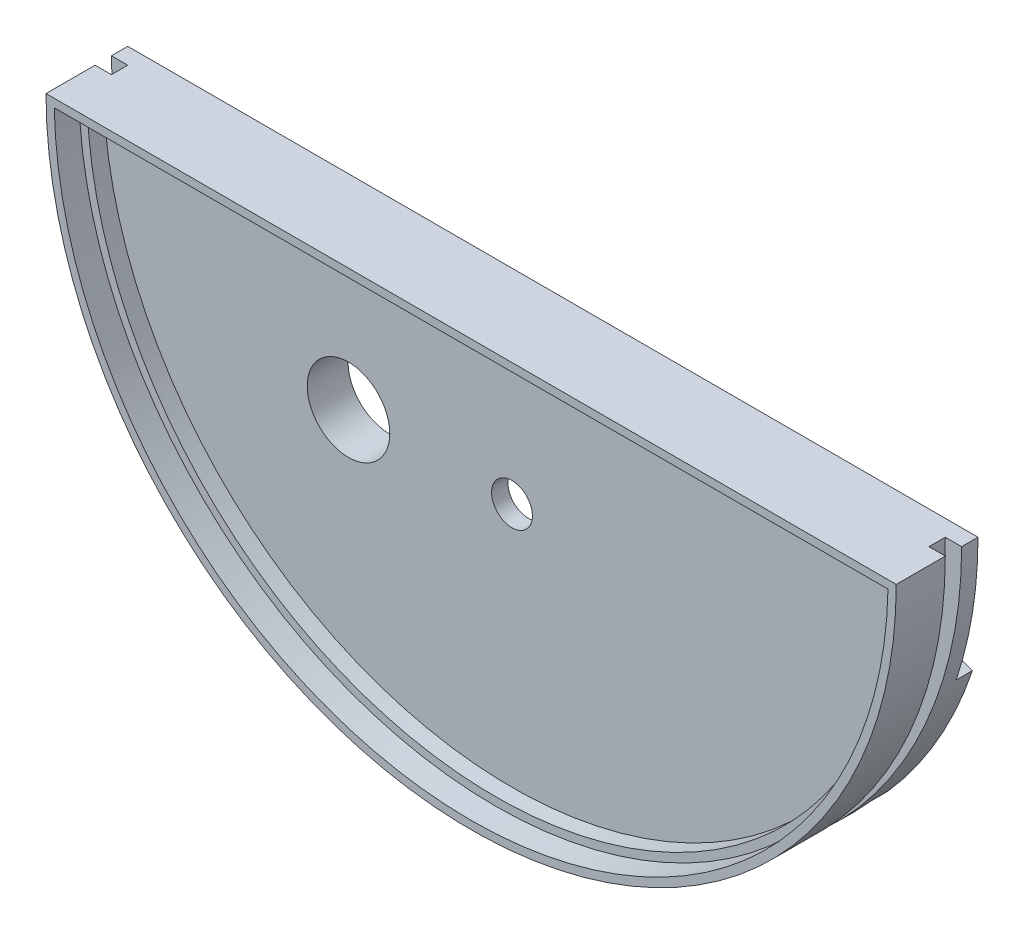
ISO-10303-21;
HEADER;
FILE_DESCRIPTION(('STEP AP214'),'2;1');
FILE_NAME('part.step','',(''),(''),'','','');
FILE_SCHEMA(('AUTOMOTIVE_DESIGN { 1 0 10303 214 1 1 1 1 }'));
ENDSEC;
DATA;
#1=APPLICATION_CONTEXT('core data for automotive mechanical design processes');
#2=APPLICATION_PROTOCOL_DEFINITION('international standard','automotive_design',2000,#1);
#3=PRODUCT_CONTEXT('',#1,'mechanical');
#4=PRODUCT('Part','Part','',(#3));
#5=PRODUCT_RELATED_PRODUCT_CATEGORY('part','',(#4));
#6=PRODUCT_DEFINITION_FORMATION('','',#4);
#7=PRODUCT_DEFINITION_CONTEXT('part definition',#1,'design');
#8=PRODUCT_DEFINITION('design','',#6,#7);
#9=PRODUCT_DEFINITION_SHAPE('','',#8);
#10=(LENGTH_UNIT() NAMED_UNIT(*) SI_UNIT(.MILLI.,.METRE.));
#11=(NAMED_UNIT(*) PLANE_ANGLE_UNIT() SI_UNIT($,.RADIAN.));
#12=(NAMED_UNIT(*) SI_UNIT($,.STERADIAN.) SOLID_ANGLE_UNIT());
#13=UNCERTAINTY_MEASURE_WITH_UNIT(LENGTH_MEASURE(1.E-05),#10,'distance_accuracy_value','');
#14=(GEOMETRIC_REPRESENTATION_CONTEXT(3) GLOBAL_UNCERTAINTY_ASSIGNED_CONTEXT((#13)) GLOBAL_UNIT_ASSIGNED_CONTEXT((#10,
#11,#12)) REPRESENTATION_CONTEXT('',''));
#15=CARTESIAN_POINT('',(0.,0.,0.));
#16=DIRECTION('',(0.,0.,1.));
#17=DIRECTION('',(1.,0.,0.));
#18=AXIS2_PLACEMENT_3D('',#15,#16,#17);
#19=CARTESIAN_POINT('',(0.,0.,-5.));
#20=DIRECTION('',(0.,0.,1.));
#21=DIRECTION('',(1.,0.,0.));
#22=AXIS2_PLACEMENT_3D('',#19,#20,#21);
#23=PLANE('',#22);
#24=CARTESIAN_POINT('',(20.,-20.,-5.));
#25=DIRECTION('',(0.,0.,1.));
#26=DIRECTION('',(1.,0.,0.));
#27=AXIS2_PLACEMENT_3D('',#24,#25,#26);
#28=CIRCLE('',#27,4.);
#29=CARTESIAN_POINT('',(24.,-20.,-5.));
#30=VERTEX_POINT('',#29);
#31=EDGE_CURVE('E364',#30,#30,#28,.F.);
#32=ORIENTED_EDGE('',*,*,#31,.F.);
#33=EDGE_LOOP('',(#32));
#34=FACE_BOUND('',#33,.T.);
#35=CARTESIAN_POINT('',(0.,-20.,-5.));
#36=DIRECTION('',(0.,0.,-1.));
#37=DIRECTION('',(-1.,0.,0.));
#38=AXIS2_PLACEMENT_3D('',#35,#36,#37);
#39=CIRCLE('',#38,9.5);
#40=CARTESIAN_POINT('',(-9.5,-20.,-5.));
#41=VERTEX_POINT('',#40);
#42=EDGE_CURVE('E241',#41,#41,#39,.T.);
#43=ORIENTED_EDGE('',*,*,#42,.F.);
#44=EDGE_LOOP('',(#43));
#45=FACE_BOUND('',#44,.T.);
#46=DIRECTION('',(-0.748528137423872,-0.663103029313507,0.));
#47=VECTOR('',#46,1.);
#48=CARTESIAN_POINT('',(7.03983839868184E-13,-7.94675471440051E-13,-5.));
#49=LINE('',#48,#47);
#50=CARTESIAN_POINT('',(-37.4264068711929,-33.1551514656761,-5.));
#51=VERTEX_POINT('',#50);
#52=CARTESIAN_POINT('',(-38.9234631460406,-34.4813575243032,-5.));
#53=VERTEX_POINT('',#52);
#54=EDGE_CURVE('E262',#51,#53,#49,.T.);
#55=ORIENTED_EDGE('',*,*,#54,.F.);
#56=CARTESIAN_POINT('',(0.,0.,-5.));
#57=DIRECTION('',(0.,0.,-1.));
#58=DIRECTION('',(-1.,0.,0.));
#59=AXIS2_PLACEMENT_3D('',#56,#57,#58);
#60=CIRCLE('',#59,50.);
#61=CARTESIAN_POINT('',(-47.4264068711929,-15.8346433899874,-5.));
#62=VERTEX_POINT('',#61);
#63=EDGE_CURVE('E245',#51,#62,#60,.T.);
#64=ORIENTED_EDGE('',*,*,#63,.T.);
#65=DIRECTION('',(-0.948528137423857,-0.316692867799747,0.));
#66=VECTOR('',#65,1.);
#67=CARTESIAN_POINT('',(0.,0.,-5.));
#68=LINE('',#67,#66);
#69=CARTESIAN_POINT('',(-49.3234631460406,-16.4680291255868,-5.));
#70=VERTEX_POINT('',#69);
#71=EDGE_CURVE('E252',#62,#70,#68,.T.);
#72=ORIENTED_EDGE('',*,*,#71,.T.);
#73=CARTESIAN_POINT('',(0.,0.,-5.));
#74=DIRECTION('',(0.,0.,1.));
#75=DIRECTION('',(1.,0.,0.));
#76=AXIS2_PLACEMENT_3D('',#73,#74,#75);
#77=CIRCLE('',#76,52.);
#78=CARTESIAN_POINT('',(-52.,0.,-5.));
#79=VERTEX_POINT('',#78);
#80=EDGE_CURVE('E356',#79,#70,#77,.T.);
#81=ORIENTED_EDGE('',*,*,#80,.F.);
#82=DIRECTION('',(-1.,0.,0.));
#83=VECTOR('',#82,1.);
#84=CARTESIAN_POINT('',(-52.,0.,-5.));
#85=LINE('',#84,#83);
#86=CARTESIAN_POINT('',(52.,0.,-5.));
#87=VERTEX_POINT('',#86);
#88=EDGE_CURVE('E351',#87,#79,#85,.T.);
#89=ORIENTED_EDGE('',*,*,#88,.F.);
#90=CARTESIAN_POINT('',(49.3234631460406,-16.4680291255869,-5.));
#91=VERTEX_POINT('',#90);
#92=EDGE_CURVE('E324',#91,#87,#77,.T.);
#93=ORIENTED_EDGE('',*,*,#92,.F.);
#94=DIRECTION('',(0.948528137423855,-0.316692867799755,0.));
#95=VECTOR('',#94,1.);
#96=CARTESIAN_POINT('',(1.18664903328477E-13,3.55413749964563E-13,-5.));
#97=LINE('',#96,#95);
#98=CARTESIAN_POINT('',(47.4264068711928,-15.8346433899874,-5.));
#99=VERTEX_POINT('',#98);
#100=EDGE_CURVE('E316',#99,#91,#97,.T.);
#101=ORIENTED_EDGE('',*,*,#100,.F.);
#102=CARTESIAN_POINT('',(0.,0.,-5.));
#103=DIRECTION('',(0.,0.,-1.));
#104=DIRECTION('',(-1.,0.,0.));
#105=AXIS2_PLACEMENT_3D('',#102,#103,#104);
#106=CIRCLE('',#105,50.);
#107=CARTESIAN_POINT('',(37.4264068711928,-33.1551514656762,-5.));
#108=VERTEX_POINT('',#107);
#109=EDGE_CURVE('E302',#99,#108,#106,.T.);
#110=ORIENTED_EDGE('',*,*,#109,.T.);
#111=DIRECTION('',(0.748528137423853,-0.663103029313527,0.));
#112=VECTOR('',#111,1.);
#113=CARTESIAN_POINT('',(1.7484565957511E-13,1.9737037852759E-13,-5.));
#114=LINE('',#113,#112);
#115=CARTESIAN_POINT('',(38.9234631460406,-34.4813575243032,-5.));
#116=VERTEX_POINT('',#115);
#117=EDGE_CURVE('E307',#108,#116,#114,.T.);
#118=ORIENTED_EDGE('',*,*,#117,.T.);
#119=CARTESIAN_POINT('',(10.4,-50.9493866498901,-5.));
#120=VERTEX_POINT('',#119);
#121=EDGE_CURVE('E342',#120,#116,#77,.T.);
#122=ORIENTED_EDGE('',*,*,#121,.F.);
#123=DIRECTION('',(0.199999999999982,-0.979795897113275,0.));
#124=VECTOR('',#123,1.);
#125=CARTESIAN_POINT('',(8.8383097108184E-13,1.80411241501572E-13,-5.));
#126=LINE('',#125,#124);
#127=CARTESIAN_POINT('',(10.,-48.9897948556635,-5.));
#128=VERTEX_POINT('',#127);
#129=EDGE_CURVE('E289',#128,#120,#126,.T.);
#130=ORIENTED_EDGE('',*,*,#129,.F.);
#131=CARTESIAN_POINT('',(0.,0.,-5.));
#132=DIRECTION('',(0.,0.,-1.));
#133=DIRECTION('',(-1.,0.,0.));
#134=AXIS2_PLACEMENT_3D('',#131,#132,#133);
#135=CIRCLE('',#134,50.);
#136=CARTESIAN_POINT('',(-10.,-48.9897948556636,-5.));
#137=VERTEX_POINT('',#136);
#138=EDGE_CURVE('E274',#128,#137,#135,.T.);
#139=ORIENTED_EDGE('',*,*,#138,.T.);
#140=DIRECTION('',(-0.200000000000004,-0.97979589711327,0.));
#141=VECTOR('',#140,1.);
#142=CARTESIAN_POINT('',(1.93762943660249E-13,0.,-5.));
#143=LINE('',#142,#141);
#144=CARTESIAN_POINT('',(-10.4,-50.9493866498901,-5.));
#145=VERTEX_POINT('',#144);
#146=EDGE_CURVE('E279',#137,#145,#143,.T.);
#147=ORIENTED_EDGE('',*,*,#146,.T.);
#148=EDGE_CURVE('E344',#53,#145,#77,.T.);
#149=ORIENTED_EDGE('',*,*,#148,.F.);
#150=EDGE_LOOP('',(#55,#64,#72,#81,#89,#93,#101,#110,#118,#122,#130,#139,#147,#149));
#151=FACE_BOUND('',#150,.T.);
#152=CARTESIAN_POINT('',(-20.,-20.,-5.));
#153=DIRECTION('',(0.,0.,1.));
#154=DIRECTION('',(1.,0.,0.));
#155=AXIS2_PLACEMENT_3D('',#152,#153,#154);
#156=CIRCLE('',#155,10.);
#157=CARTESIAN_POINT('',(-9.99999999999999,-20.,-5.));
#158=VERTEX_POINT('',#157);
#159=EDGE_CURVE('E38',#158,#158,#156,.F.);
#160=ORIENTED_EDGE('',*,*,#159,.F.);
#161=EDGE_LOOP('',(#160));
#162=FACE_BOUND('',#161,.T.);
#163=ADVANCED_FACE('F34',(#34,#45,#151,#162),#23,.F.);
#164=CARTESIAN_POINT('',(-20.,-20.,-5.));
#165=DIRECTION('',(0.,0.,1.));
#166=DIRECTION('',(1.,0.,0.));
#167=AXIS2_PLACEMENT_3D('',#164,#165,#166);
#168=CIRCLE('',#167,5.05);
#169=CARTESIAN_POINT('',(-14.95,-20.,-5.));
#170=VERTEX_POINT('',#169);
#171=EDGE_CURVE('E386',#170,#170,#168,.T.);
#172=ORIENTED_EDGE('',*,*,#171,.T.);
#173=EDGE_LOOP('',(#172));
#174=FACE_BOUND('',#173,.T.);
#175=CARTESIAN_POINT('',(-20.,-20.,-5.));
#176=DIRECTION('',(0.,0.,-1.));
#177=DIRECTION('',(-1.,0.,0.));
#178=AXIS2_PLACEMENT_3D('',#175,#176,#177);
#179=CIRCLE('',#178,6.);
#180=CARTESIAN_POINT('',(-26.,-20.,-5.));
#181=VERTEX_POINT('',#180);
#182=EDGE_CURVE('E210',#181,#181,#179,.F.);
#183=ORIENTED_EDGE('',*,*,#182,.F.);
#184=EDGE_LOOP('',(#183));
#185=FACE_BOUND('',#184,.T.);
#186=ADVANCED_FACE('F409',(#174,#185),#23,.F.);
#187=CARTESIAN_POINT('',(0.,0.,-5.));
#188=DIRECTION('',(0.,0.,1.));
#189=DIRECTION('',(1.,0.,0.));
#190=AXIS2_PLACEMENT_3D('',#187,#188,#189);
#191=CYLINDRICAL_SURFACE('',#190,52.);
#192=DIRECTION('',(0.,0.,1.));
#193=VECTOR('',#192,1.);
#194=CARTESIAN_POINT('',(-52.,0.,-5.));
#195=LINE('',#194,#193);
#196=CARTESIAN_POINT('',(-52.,0.,-1.));
#197=VERTEX_POINT('',#196);
#198=CARTESIAN_POINT('',(-52.,0.,5.));
#199=VERTEX_POINT('',#198);
#200=EDGE_CURVE('E360',#197,#199,#195,.T.);
#201=ORIENTED_EDGE('',*,*,#200,.F.);
#202=CARTESIAN_POINT('',(0.,0.,-1.));
#203=DIRECTION('',(0.,0.,-1.));
#204=DIRECTION('',(-1.,0.,0.));
#205=AXIS2_PLACEMENT_3D('',#202,#203,#204);
#206=CIRCLE('',#205,52.);
#207=CARTESIAN_POINT('',(52.,0.,-1.));
#208=VERTEX_POINT('',#207);
#209=EDGE_CURVE('E52',#197,#208,#206,.F.);
#210=ORIENTED_EDGE('',*,*,#209,.T.);
#211=DIRECTION('',(0.,0.,1.));
#212=VECTOR('',#211,1.);
#213=CARTESIAN_POINT('',(52.,0.,-5.));
#214=LINE('',#213,#212);
#215=CARTESIAN_POINT('',(52.,0.,5.));
#216=VERTEX_POINT('',#215);
#217=EDGE_CURVE('E361',#208,#216,#214,.T.);
#218=ORIENTED_EDGE('',*,*,#217,.T.);
#219=CARTESIAN_POINT('',(0.,0.,5.));
#220=DIRECTION('',(0.,0.,1.));
#221=DIRECTION('',(1.,0.,0.));
#222=AXIS2_PLACEMENT_3D('',#219,#220,#221);
#223=CIRCLE('',#222,52.);
#224=EDGE_CURVE('E378',#199,#216,#223,.T.);
#225=ORIENTED_EDGE('',*,*,#224,.F.);
#226=EDGE_LOOP('',(#201,#210,#218,#225));
#227=FACE_BOUND('',#226,.T.);
#228=ADVANCED_FACE('F380',(#227),#191,.T.);
#229=CARTESIAN_POINT('',(0.,0.,5.));
#230=DIRECTION('',(0.,0.,-1.));
#231=DIRECTION('',(-1.,0.,0.));
#232=AXIS2_PLACEMENT_3D('',#229,#230,#231);
#233=CYLINDRICAL_SURFACE('',#232,50.);
#234=DIRECTION('',(0.,0.,-1.));
#235=VECTOR('',#234,1.);
#236=CARTESIAN_POINT('',(-49.9599839871872,-2.00000000000002,5.));
#237=LINE('',#236,#235);
#238=CARTESIAN_POINT('',(-49.9599839871872,-2.00000000000002,2.));
#239=VERTEX_POINT('',#238);
#240=CARTESIAN_POINT('',(-49.9599839871872,-2.00000000000002,0.));
#241=VERTEX_POINT('',#240);
#242=EDGE_CURVE('E383',#239,#241,#237,.T.);
#243=ORIENTED_EDGE('',*,*,#242,.F.);
#244=CARTESIAN_POINT('',(0.,0.,2.));
#245=DIRECTION('',(0.,0.,1.));
#246=DIRECTION('',(1.,0.,0.));
#247=AXIS2_PLACEMENT_3D('',#244,#245,#246);
#248=CIRCLE('',#247,50.);
#249=CARTESIAN_POINT('',(49.9599839871872,-2.,2.));
#250=VERTEX_POINT('',#249);
#251=EDGE_CURVE('E228',#239,#250,#248,.T.);
#252=ORIENTED_EDGE('',*,*,#251,.T.);
#253=DIRECTION('',(0.,0.,-1.));
#254=VECTOR('',#253,1.);
#255=CARTESIAN_POINT('',(49.9599839871872,-2.,5.));
#256=LINE('',#255,#254);
#257=CARTESIAN_POINT('',(49.9599839871872,-2.,0.));
#258=VERTEX_POINT('',#257);
#259=EDGE_CURVE('E381',#250,#258,#256,.T.);
#260=ORIENTED_EDGE('',*,*,#259,.T.);
#261=CARTESIAN_POINT('',(0.,0.,0.));
#262=DIRECTION('',(0.,0.,1.));
#263=DIRECTION('',(1.,0.,0.));
#264=AXIS2_PLACEMENT_3D('',#261,#262,#263);
#265=CIRCLE('',#264,50.);
#266=EDGE_CURVE('E534',#241,#258,#265,.T.);
#267=ORIENTED_EDGE('',*,*,#266,.F.);
#268=EDGE_LOOP('',(#243,#252,#260,#267));
#269=FACE_BOUND('',#268,.T.);
#270=ADVANCED_FACE('F421',(#269),#233,.F.);
#271=CARTESIAN_POINT('',(49.9599839871872,-2.,5.));
#272=DIRECTION('',(0.,-1.,0.));
#273=DIRECTION('',(1.,0.,0.));
#274=AXIS2_PLACEMENT_3D('',#271,#272,#273);
#275=PLANE('',#274);
#276=ORIENTED_EDGE('',*,*,#259,.F.);
#277=DIRECTION('',(-1.,0.,0.));
#278=VECTOR('',#277,1.);
#279=CARTESIAN_POINT('',(49.9599839871872,-2.,2.));
#280=LINE('',#279,#278);
#281=EDGE_CURVE('E367',#250,#239,#280,.T.);
#282=ORIENTED_EDGE('',*,*,#281,.T.);
#283=ORIENTED_EDGE('',*,*,#242,.T.);
#284=DIRECTION('',(-1.,0.,0.));
#285=VECTOR('',#284,1.);
#286=CARTESIAN_POINT('',(49.9599839871872,-2.,0.));
#287=LINE('',#286,#285);
#288=EDGE_CURVE('E535',#258,#241,#287,.T.);
#289=ORIENTED_EDGE('',*,*,#288,.F.);
#290=EDGE_LOOP('',(#276,#282,#283,#289));
#291=FACE_BOUND('',#290,.T.);
#292=ADVANCED_FACE('F424',(#291),#275,.T.);
#293=CARTESIAN_POINT('',(0.,0.,-3.));
#294=DIRECTION('',(0.,0.,-1.));
#295=DIRECTION('',(-1.,0.,0.));
#296=AXIS2_PLACEMENT_3D('',#293,#294,#295);
#297=CIRCLE('',#296,52.);
#298=CARTESIAN_POINT('',(-52.,3.63114059239686E-13,-3.));
#299=VERTEX_POINT('',#298);
#300=CARTESIAN_POINT('',(52.,0.,-3.));
#301=VERTEX_POINT('',#300);
#302=EDGE_CURVE('E189',#299,#301,#297,.F.);
#303=ORIENTED_EDGE('',*,*,#302,.F.);
#304=EDGE_CURVE('E362',#79,#299,#195,.T.);
#305=ORIENTED_EDGE('',*,*,#304,.F.);
#306=ORIENTED_EDGE('',*,*,#80,.T.);
#307=DIRECTION('',(0.,0.,1.));
#308=VECTOR('',#307,1.);
#309=CARTESIAN_POINT('',(-49.3234631460406,-16.4680291255868,-7.));
#310=LINE('',#309,#308);
#311=CARTESIAN_POINT('',(-49.3234631460406,-16.4680291255868,-7.));
#312=VERTEX_POINT('',#311);
#313=EDGE_CURVE('E268',#312,#70,#310,.T.);
#314=ORIENTED_EDGE('',*,*,#313,.F.);
#315=CARTESIAN_POINT('',(0.,0.,-7.));
#316=DIRECTION('',(0.,0.,-1.));
#317=DIRECTION('',(-1.,0.,0.));
#318=AXIS2_PLACEMENT_3D('',#315,#316,#317);
#319=CIRCLE('',#318,52.);
#320=CARTESIAN_POINT('',(-38.9234631460406,-34.4813575243032,-7.));
#321=VERTEX_POINT('',#320);
#322=EDGE_CURVE('E254',#321,#312,#319,.T.);
#323=ORIENTED_EDGE('',*,*,#322,.F.);
#324=DIRECTION('',(0.,0.,1.));
#325=VECTOR('',#324,1.);
#326=CARTESIAN_POINT('',(-38.9234631460406,-34.4813575243032,-7.));
#327=LINE('',#326,#325);
#328=EDGE_CURVE('E270',#321,#53,#327,.T.);
#329=ORIENTED_EDGE('',*,*,#328,.T.);
#330=ORIENTED_EDGE('',*,*,#148,.T.);
#331=DIRECTION('',(0.,0.,1.));
#332=VECTOR('',#331,1.);
#333=CARTESIAN_POINT('',(-10.4,-50.9493866498901,-7.));
#334=LINE('',#333,#332);
#335=CARTESIAN_POINT('',(-10.4,-50.9493866498901,-7.));
#336=VERTEX_POINT('',#335);
#337=EDGE_CURVE('E294',#336,#145,#334,.T.);
#338=ORIENTED_EDGE('',*,*,#337,.F.);
#339=CARTESIAN_POINT('',(0.,0.,-7.));
#340=DIRECTION('',(0.,0.,-1.));
#341=DIRECTION('',(-1.,0.,0.));
#342=AXIS2_PLACEMENT_3D('',#339,#340,#341);
#343=CIRCLE('',#342,52.);
#344=CARTESIAN_POINT('',(10.4,-50.9493866498901,-7.));
#345=VERTEX_POINT('',#344);
#346=EDGE_CURVE('E281',#345,#336,#343,.T.);
#347=ORIENTED_EDGE('',*,*,#346,.F.);
#348=DIRECTION('',(0.,0.,1.));
#349=VECTOR('',#348,1.);
#350=CARTESIAN_POINT('',(10.4,-50.9493866498901,-7.));
#351=LINE('',#350,#349);
#352=EDGE_CURVE('E297',#345,#120,#351,.T.);
#353=ORIENTED_EDGE('',*,*,#352,.T.);
#354=ORIENTED_EDGE('',*,*,#121,.T.);
#355=DIRECTION('',(0.,0.,1.));
#356=VECTOR('',#355,1.);
#357=CARTESIAN_POINT('',(38.9234631460406,-34.4813575243032,-7.));
#358=LINE('',#357,#356);
#359=CARTESIAN_POINT('',(38.9234631460406,-34.4813575243032,-7.));
#360=VERTEX_POINT('',#359);
#361=EDGE_CURVE('E331',#360,#116,#358,.T.);
#362=ORIENTED_EDGE('',*,*,#361,.F.);
#363=CARTESIAN_POINT('',(0.,0.,-7.));
#364=DIRECTION('',(0.,0.,-1.));
#365=DIRECTION('',(-1.,0.,0.));
#366=AXIS2_PLACEMENT_3D('',#363,#364,#365);
#367=CIRCLE('',#366,52.);
#368=CARTESIAN_POINT('',(49.3234631460406,-16.4680291255869,-7.));
#369=VERTEX_POINT('',#368);
#370=EDGE_CURVE('E309',#369,#360,#367,.T.);
#371=ORIENTED_EDGE('',*,*,#370,.F.);
#372=DIRECTION('',(0.,0.,1.));
#373=VECTOR('',#372,1.);
#374=CARTESIAN_POINT('',(49.3234631460406,-16.4680291255869,-7.));
#375=LINE('',#374,#373);
#376=EDGE_CURVE('E327',#369,#91,#375,.T.);
#377=ORIENTED_EDGE('',*,*,#376,.T.);
#378=ORIENTED_EDGE('',*,*,#92,.T.);
#379=EDGE_CURVE('E359',#87,#301,#214,.T.);
#380=ORIENTED_EDGE('',*,*,#379,.T.);
#381=EDGE_LOOP('',(#303,#305,#306,#314,#323,#329,#330,#338,#347,#353,#354,#362,#371,#377,#378,#380));
#382=FACE_BOUND('',#381,.T.);
#383=ADVANCED_FACE('F36',(#382),#191,.T.);
#384=CARTESIAN_POINT('',(-52.,0.,-5.));
#385=DIRECTION('',(0.,1.,0.));
#386=DIRECTION('',(0.,0.,1.));
#387=AXIS2_PLACEMENT_3D('',#384,#385,#386);
#388=PLANE('',#387);
#389=DIRECTION('',(-1.,0.,0.));
#390=VECTOR('',#389,1.);
#391=CARTESIAN_POINT('',(-52.,0.,-3.));
#392=LINE('',#391,#390);
#393=CARTESIAN_POINT('',(50.,0.,-3.));
#394=VERTEX_POINT('',#393);
#395=EDGE_CURVE('E11',#301,#394,#392,.T.);
#396=ORIENTED_EDGE('',*,*,#395,.F.);
#397=ORIENTED_EDGE('',*,*,#379,.F.);
#398=ORIENTED_EDGE('',*,*,#88,.T.);
#399=ORIENTED_EDGE('',*,*,#304,.T.);
#400=CARTESIAN_POINT('',(-50.,3.49148133884313E-13,-3.));
#401=VERTEX_POINT('',#400);
#402=EDGE_CURVE('E45',#401,#299,#392,.T.);
#403=ORIENTED_EDGE('',*,*,#402,.F.);
#404=DIRECTION('',(0.,0.,-1.));
#405=VECTOR('',#404,1.);
#406=CARTESIAN_POINT('',(-50.,3.49148133884313E-13,-0.999999999999999));
#407=LINE('',#406,#405);
#408=CARTESIAN_POINT('',(-50.,3.49148133884313E-13,-0.999999999999999));
#409=VERTEX_POINT('',#408);
#410=EDGE_CURVE('E201',#409,#401,#407,.T.);
#411=ORIENTED_EDGE('',*,*,#410,.F.);
#412=DIRECTION('',(-1.,0.,0.));
#413=VECTOR('',#412,1.);
#414=CARTESIAN_POINT('',(-52.,0.,-1.));
#415=LINE('',#414,#413);
#416=EDGE_CURVE('E373',#409,#197,#415,.T.);
#417=ORIENTED_EDGE('',*,*,#416,.T.);
#418=ORIENTED_EDGE('',*,*,#200,.T.);
#419=DIRECTION('',(-1.,0.,0.));
#420=VECTOR('',#419,1.);
#421=CARTESIAN_POINT('',(52.,0.,5.));
#422=LINE('',#421,#420);
#423=EDGE_CURVE('E371',#216,#199,#422,.T.);
#424=ORIENTED_EDGE('',*,*,#423,.F.);
#425=ORIENTED_EDGE('',*,*,#217,.F.);
#426=CARTESIAN_POINT('',(50.,0.,-0.999999999999999));
#427=VERTEX_POINT('',#426);
#428=EDGE_CURVE('E43',#208,#427,#415,.T.);
#429=ORIENTED_EDGE('',*,*,#428,.T.);
#430=DIRECTION('',(0.,0.,-1.));
#431=VECTOR('',#430,1.);
#432=CARTESIAN_POINT('',(50.,0.,-0.999999999999999));
#433=LINE('',#432,#431);
#434=EDGE_CURVE('E198',#427,#394,#433,.T.);
#435=ORIENTED_EDGE('',*,*,#434,.T.);
#436=EDGE_LOOP('',(#396,#397,#398,#399,#403,#411,#417,#418,#424,#425,#429,#435));
#437=FACE_BOUND('',#436,.T.);
#438=ADVANCED_FACE('F205',(#437),#388,.T.);
#439=CARTESIAN_POINT('',(0.,0.,0.));
#440=DIRECTION('',(0.,0.,1.));
#441=DIRECTION('',(1.,0.,0.));
#442=AXIS2_PLACEMENT_3D('',#439,#440,#441);
#443=PLANE('',#442);
#444=CARTESIAN_POINT('',(0.,-20.,0.));
#445=DIRECTION('',(0.,0.,1.));
#446=DIRECTION('',(1.,0.,0.));
#447=AXIS2_PLACEMENT_3D('',#444,#445,#446);
#448=CIRCLE('',#447,2.5);
#449=CARTESIAN_POINT('',(2.5,-20.,0.));
#450=VERTEX_POINT('',#449);
#451=EDGE_CURVE('E238',#450,#450,#448,.T.);
#452=ORIENTED_EDGE('',*,*,#451,.F.);
#453=EDGE_LOOP('',(#452));
#454=FACE_BOUND('',#453,.T.);
#455=ORIENTED_EDGE('',*,*,#266,.T.);
#456=ORIENTED_EDGE('',*,*,#288,.T.);
#457=EDGE_LOOP('',(#455,#456));
#458=FACE_BOUND('',#457,.T.);
#459=CARTESIAN_POINT('',(-20.,-20.,0.));
#460=DIRECTION('',(0.,0.,1.));
#461=DIRECTION('',(1.,0.,0.));
#462=AXIS2_PLACEMENT_3D('',#459,#460,#461);
#463=CIRCLE('',#462,5.05);
#464=CARTESIAN_POINT('',(-14.95,-20.,0.));
#465=VERTEX_POINT('',#464);
#466=EDGE_CURVE('E349',#465,#465,#463,.T.);
#467=ORIENTED_EDGE('',*,*,#466,.F.);
#468=EDGE_LOOP('',(#467));
#469=FACE_BOUND('',#468,.T.);
#470=ADVANCED_FACE('F395',(#454,#458,#469),#443,.T.);
#471=CARTESIAN_POINT('',(-20.,-20.,-5.));
#472=DIRECTION('',(0.,0.,1.));
#473=DIRECTION('',(1.,0.,0.));
#474=AXIS2_PLACEMENT_3D('',#471,#472,#473);
#475=CYLINDRICAL_SURFACE('',#474,5.05);
#476=ORIENTED_EDGE('',*,*,#171,.F.);
#477=EDGE_LOOP('',(#476));
#478=FACE_BOUND('',#477,.T.);
#479=ORIENTED_EDGE('',*,*,#466,.T.);
#480=EDGE_LOOP('',(#479));
#481=FACE_BOUND('',#480,.T.);
#482=ADVANCED_FACE('F393',(#478,#481),#475,.F.);
#483=CARTESIAN_POINT('',(0.,0.,5.));
#484=DIRECTION('',(0.,0.,1.));
#485=DIRECTION('',(1.,0.,0.));
#486=AXIS2_PLACEMENT_3D('',#483,#484,#485);
#487=PLANE('',#486);
#488=DIRECTION('',(-1.,0.,0.));
#489=VECTOR('',#488,1.);
#490=CARTESIAN_POINT('',(0.,-1.00000000000001,5.));
#491=LINE('',#490,#489);
#492=CARTESIAN_POINT('',(50.9901951359278,-0.999999999999999,5.));
#493=VERTEX_POINT('',#492);
#494=CARTESIAN_POINT('',(-50.9901951359278,-1.00000000000002,5.));
#495=VERTEX_POINT('',#494);
#496=EDGE_CURVE('E60',#493,#495,#491,.T.);
#497=ORIENTED_EDGE('',*,*,#496,.F.);
#498=CARTESIAN_POINT('',(0.,0.,5.));
#499=DIRECTION('',(0.,0.,1.));
#500=DIRECTION('',(1.,0.,0.));
#501=AXIS2_PLACEMENT_3D('',#498,#499,#500);
#502=CIRCLE('',#501,51.);
#503=EDGE_CURVE('E219',#495,#493,#502,.T.);
#504=ORIENTED_EDGE('',*,*,#503,.F.);
#505=EDGE_LOOP('',(#497,#504));
#506=FACE_BOUND('',#505,.T.);
#507=ORIENTED_EDGE('',*,*,#224,.T.);
#508=ORIENTED_EDGE('',*,*,#423,.T.);
#509=EDGE_LOOP('',(#507,#508));
#510=FACE_BOUND('',#509,.T.);
#511=ADVANCED_FACE('F377',(#506,#510),#487,.T.);
#512=CARTESIAN_POINT('',(0.,0.,-7.));
#513=DIRECTION('',(0.,0.,1.));
#514=DIRECTION('',(1.,0.,0.));
#515=AXIS2_PLACEMENT_3D('',#512,#513,#514);
#516=CYLINDRICAL_SURFACE('',#515,50.);
#517=ORIENTED_EDGE('',*,*,#109,.F.);
#518=DIRECTION('',(0.,0.,1.));
#519=VECTOR('',#518,1.);
#520=CARTESIAN_POINT('',(47.4264068711928,-15.8346433899874,-7.));
#521=LINE('',#520,#519);
#522=CARTESIAN_POINT('',(47.4264068711928,-15.8346433899874,-7.));
#523=VERTEX_POINT('',#522);
#524=EDGE_CURVE('E330',#523,#99,#521,.T.);
#525=ORIENTED_EDGE('',*,*,#524,.F.);
#526=CARTESIAN_POINT('',(0.,0.,-7.));
#527=DIRECTION('',(0.,0.,-1.));
#528=DIRECTION('',(-1.,0.,0.));
#529=AXIS2_PLACEMENT_3D('',#526,#527,#528);
#530=CIRCLE('',#529,50.);
#531=CARTESIAN_POINT('',(37.4264068711928,-33.1551514656762,-7.));
#532=VERTEX_POINT('',#531);
#533=EDGE_CURVE('E303',#523,#532,#530,.T.);
#534=ORIENTED_EDGE('',*,*,#533,.T.);
#535=DIRECTION('',(0.,0.,1.));
#536=VECTOR('',#535,1.);
#537=CARTESIAN_POINT('',(37.4264068711928,-33.1551514656762,-7.));
#538=LINE('',#537,#536);
#539=EDGE_CURVE('E314',#532,#108,#538,.T.);
#540=ORIENTED_EDGE('',*,*,#539,.T.);
#541=EDGE_LOOP('',(#517,#525,#534,#540));
#542=FACE_BOUND('',#541,.T.);
#543=ADVANCED_FACE('F419',(#542),#516,.F.);
#544=CARTESIAN_POINT('',(1.18664903328477E-13,3.55413749964563E-13,-7.));
#545=DIRECTION('',(-0.316692867799755,-0.948528137423855,0.));
#546=DIRECTION('',(0.948528137423855,-0.316692867799755,0.));
#547=AXIS2_PLACEMENT_3D('',#544,#545,#546);
#548=PLANE('',#547);
#549=ORIENTED_EDGE('',*,*,#100,.T.);
#550=ORIENTED_EDGE('',*,*,#376,.F.);
#551=DIRECTION('',(0.948528137423855,-0.316692867799755,0.));
#552=VECTOR('',#551,1.);
#553=CARTESIAN_POINT('',(1.18664903328477E-13,3.55413749964563E-13,-7.));
#554=LINE('',#553,#552);
#555=EDGE_CURVE('E306',#523,#369,#554,.T.);
#556=ORIENTED_EDGE('',*,*,#555,.F.);
#557=ORIENTED_EDGE('',*,*,#524,.T.);
#558=EDGE_LOOP('',(#549,#550,#556,#557));
#559=FACE_BOUND('',#558,.T.);
#560=ADVANCED_FACE('F431',(#559),#548,.F.);
#561=CARTESIAN_POINT('',(1.7484565957511E-13,1.9737037852759E-13,-7.));
#562=DIRECTION('',(-0.663103029313527,-0.748528137423853,0.));
#563=DIRECTION('',(0.748528137423853,-0.663103029313527,0.));
#564=AXIS2_PLACEMENT_3D('',#561,#562,#563);
#565=PLANE('',#564);
#566=ORIENTED_EDGE('',*,*,#117,.F.);
#567=ORIENTED_EDGE('',*,*,#539,.F.);
#568=DIRECTION('',(0.748528137423853,-0.663103029313527,0.));
#569=VECTOR('',#568,1.);
#570=CARTESIAN_POINT('',(1.7484565957511E-13,1.9737037852759E-13,-7.));
#571=LINE('',#570,#569);
#572=EDGE_CURVE('E311',#532,#360,#571,.T.);
#573=ORIENTED_EDGE('',*,*,#572,.T.);
#574=ORIENTED_EDGE('',*,*,#361,.T.);
#575=EDGE_LOOP('',(#566,#567,#573,#574));
#576=FACE_BOUND('',#575,.T.);
#577=ADVANCED_FACE('F435',(#576),#565,.T.);
#578=CARTESIAN_POINT('',(0.,0.,-7.));
#579=DIRECTION('',(0.,0.,-1.));
#580=DIRECTION('',(-1.,0.,0.));
#581=AXIS2_PLACEMENT_3D('',#578,#579,#580);
#582=PLANE('',#581);
#583=ORIENTED_EDGE('',*,*,#533,.F.);
#584=ORIENTED_EDGE('',*,*,#555,.T.);
#585=ORIENTED_EDGE('',*,*,#370,.T.);
#586=ORIENTED_EDGE('',*,*,#572,.F.);
#587=EDGE_LOOP('',(#583,#584,#585,#586));
#588=FACE_BOUND('',#587,.T.);
#589=ADVANCED_FACE('F439',(#588),#582,.T.);
#590=CARTESIAN_POINT('',(0.,0.,-7.));
#591=DIRECTION('',(0.,0.,1.));
#592=DIRECTION('',(1.,0.,0.));
#593=AXIS2_PLACEMENT_3D('',#590,#591,#592);
#594=CYLINDRICAL_SURFACE('',#593,50.);
#595=ORIENTED_EDGE('',*,*,#138,.F.);
#596=DIRECTION('',(0.,0.,1.));
#597=VECTOR('',#596,1.);
#598=CARTESIAN_POINT('',(10.,-48.9897948556635,-7.));
#599=LINE('',#598,#597);
#600=CARTESIAN_POINT('',(10.,-48.9897948556635,-7.));
#601=VERTEX_POINT('',#600);
#602=EDGE_CURVE('E300',#601,#128,#599,.T.);
#603=ORIENTED_EDGE('',*,*,#602,.F.);
#604=CARTESIAN_POINT('',(0.,0.,-7.));
#605=DIRECTION('',(0.,0.,-1.));
#606=DIRECTION('',(-1.,0.,0.));
#607=AXIS2_PLACEMENT_3D('',#604,#605,#606);
#608=CIRCLE('',#607,50.);
#609=CARTESIAN_POINT('',(-10.,-48.9897948556636,-7.));
#610=VERTEX_POINT('',#609);
#611=EDGE_CURVE('E275',#601,#610,#608,.T.);
#612=ORIENTED_EDGE('',*,*,#611,.T.);
#613=DIRECTION('',(0.,0.,1.));
#614=VECTOR('',#613,1.);
#615=CARTESIAN_POINT('',(-10.,-48.9897948556636,-7.));
#616=LINE('',#615,#614);
#617=EDGE_CURVE('E286',#610,#137,#616,.T.);
#618=ORIENTED_EDGE('',*,*,#617,.T.);
#619=EDGE_LOOP('',(#595,#603,#612,#618));
#620=FACE_BOUND('',#619,.T.);
#621=ADVANCED_FACE('F443',(#620),#594,.F.);
#622=CARTESIAN_POINT('',(8.8383097108184E-13,1.80411241501572E-13,-7.));
#623=DIRECTION('',(-0.979795897113275,-0.199999999999982,0.));
#624=DIRECTION('',(0.199999999999982,-0.979795897113275,0.));
#625=AXIS2_PLACEMENT_3D('',#622,#623,#624);
#626=PLANE('',#625);
#627=ORIENTED_EDGE('',*,*,#129,.T.);
#628=ORIENTED_EDGE('',*,*,#352,.F.);
#629=DIRECTION('',(0.199999999999982,-0.979795897113275,0.));
#630=VECTOR('',#629,1.);
#631=CARTESIAN_POINT('',(8.8383097108184E-13,1.80411241501572E-13,-7.));
#632=LINE('',#631,#630);
#633=EDGE_CURVE('E278',#601,#345,#632,.T.);
#634=ORIENTED_EDGE('',*,*,#633,.F.);
#635=ORIENTED_EDGE('',*,*,#602,.T.);
#636=EDGE_LOOP('',(#627,#628,#634,#635));
#637=FACE_BOUND('',#636,.T.);
#638=ADVANCED_FACE('F447',(#637),#626,.F.);
#639=CARTESIAN_POINT('',(1.93762943660249E-13,0.,-7.));
#640=DIRECTION('',(-0.979795897113271,0.200000000000004,0.));
#641=DIRECTION('',(-0.200000000000004,-0.979795897113271,0.));
#642=AXIS2_PLACEMENT_3D('',#639,#640,#641);
#643=PLANE('',#642);
#644=ORIENTED_EDGE('',*,*,#146,.F.);
#645=ORIENTED_EDGE('',*,*,#617,.F.);
#646=DIRECTION('',(-0.200000000000004,-0.97979589711327,0.));
#647=VECTOR('',#646,1.);
#648=CARTESIAN_POINT('',(1.93762943660249E-13,0.,-7.));
#649=LINE('',#648,#647);
#650=EDGE_CURVE('E283',#610,#336,#649,.T.);
#651=ORIENTED_EDGE('',*,*,#650,.T.);
#652=ORIENTED_EDGE('',*,*,#337,.T.);
#653=EDGE_LOOP('',(#644,#645,#651,#652));
#654=FACE_BOUND('',#653,.T.);
#655=ADVANCED_FACE('F451',(#654),#643,.T.);
#656=CARTESIAN_POINT('',(0.,0.,-7.));
#657=DIRECTION('',(0.,0.,-1.));
#658=DIRECTION('',(-1.,0.,0.));
#659=AXIS2_PLACEMENT_3D('',#656,#657,#658);
#660=PLANE('',#659);
#661=ORIENTED_EDGE('',*,*,#611,.F.);
#662=ORIENTED_EDGE('',*,*,#633,.T.);
#663=ORIENTED_EDGE('',*,*,#346,.T.);
#664=ORIENTED_EDGE('',*,*,#650,.F.);
#665=EDGE_LOOP('',(#661,#662,#663,#664));
#666=FACE_BOUND('',#665,.T.);
#667=ADVANCED_FACE('F455',(#666),#660,.T.);
#668=CARTESIAN_POINT('',(0.,0.,-7.));
#669=DIRECTION('',(0.,0.,1.));
#670=DIRECTION('',(1.,0.,0.));
#671=AXIS2_PLACEMENT_3D('',#668,#669,#670);
#672=CYLINDRICAL_SURFACE('',#671,50.);
#673=ORIENTED_EDGE('',*,*,#63,.F.);
#674=DIRECTION('',(0.,0.,1.));
#675=VECTOR('',#674,1.);
#676=CARTESIAN_POINT('',(-37.4264068711929,-33.1551514656761,-7.));
#677=LINE('',#676,#675);
#678=CARTESIAN_POINT('',(-37.4264068711929,-33.1551514656761,-7.));
#679=VERTEX_POINT('',#678);
#680=EDGE_CURVE('E272',#679,#51,#677,.T.);
#681=ORIENTED_EDGE('',*,*,#680,.F.);
#682=CARTESIAN_POINT('',(0.,0.,-7.));
#683=DIRECTION('',(0.,0.,-1.));
#684=DIRECTION('',(-1.,0.,0.));
#685=AXIS2_PLACEMENT_3D('',#682,#683,#684);
#686=CIRCLE('',#685,50.);
#687=CARTESIAN_POINT('',(-47.4264068711929,-15.8346433899874,-7.));
#688=VERTEX_POINT('',#687);
#689=EDGE_CURVE('E248',#679,#688,#686,.T.);
#690=ORIENTED_EDGE('',*,*,#689,.T.);
#691=DIRECTION('',(0.,0.,1.));
#692=VECTOR('',#691,1.);
#693=CARTESIAN_POINT('',(-47.4264068711929,-15.8346433899874,-7.));
#694=LINE('',#693,#692);
#695=EDGE_CURVE('E259',#688,#62,#694,.T.);
#696=ORIENTED_EDGE('',*,*,#695,.T.);
#697=EDGE_LOOP('',(#673,#681,#690,#696));
#698=FACE_BOUND('',#697,.T.);
#699=ADVANCED_FACE('F459',(#698),#672,.F.);
#700=CARTESIAN_POINT('',(7.03983839868184E-13,-7.94675471440051E-13,-7.));
#701=DIRECTION('',(-0.663103029313507,0.748528137423872,0.));
#702=DIRECTION('',(-0.748528137423872,-0.663103029313507,0.));
#703=AXIS2_PLACEMENT_3D('',#700,#701,#702);
#704=PLANE('',#703);
#705=ORIENTED_EDGE('',*,*,#54,.T.);
#706=ORIENTED_EDGE('',*,*,#328,.F.);
#707=DIRECTION('',(-0.748528137423872,-0.663103029313507,0.));
#708=VECTOR('',#707,1.);
#709=CARTESIAN_POINT('',(7.03983839868184E-13,-7.94675471440051E-13,-7.));
#710=LINE('',#709,#708);
#711=EDGE_CURVE('E251',#679,#321,#710,.T.);
#712=ORIENTED_EDGE('',*,*,#711,.F.);
#713=ORIENTED_EDGE('',*,*,#680,.T.);
#714=EDGE_LOOP('',(#705,#706,#712,#713));
#715=FACE_BOUND('',#714,.T.);
#716=ADVANCED_FACE('F463',(#715),#704,.F.);
#717=CARTESIAN_POINT('',(0.,0.,-7.));
#718=DIRECTION('',(-0.316692867799747,0.948528137423857,0.));
#719=DIRECTION('',(-0.948528137423857,-0.316692867799747,0.));
#720=AXIS2_PLACEMENT_3D('',#717,#718,#719);
#721=PLANE('',#720);
#722=ORIENTED_EDGE('',*,*,#71,.F.);
#723=ORIENTED_EDGE('',*,*,#695,.F.);
#724=DIRECTION('',(-0.948528137423857,-0.316692867799747,0.));
#725=VECTOR('',#724,1.);
#726=CARTESIAN_POINT('',(0.,0.,-7.));
#727=LINE('',#726,#725);
#728=EDGE_CURVE('E256',#688,#312,#727,.T.);
#729=ORIENTED_EDGE('',*,*,#728,.T.);
#730=ORIENTED_EDGE('',*,*,#313,.T.);
#731=EDGE_LOOP('',(#722,#723,#729,#730));
#732=FACE_BOUND('',#731,.T.);
#733=ADVANCED_FACE('F467',(#732),#721,.T.);
#734=CARTESIAN_POINT('',(0.,0.,-7.));
#735=DIRECTION('',(0.,0.,-1.));
#736=DIRECTION('',(-1.,0.,0.));
#737=AXIS2_PLACEMENT_3D('',#734,#735,#736);
#738=PLANE('',#737);
#739=ORIENTED_EDGE('',*,*,#689,.F.);
#740=ORIENTED_EDGE('',*,*,#711,.T.);
#741=ORIENTED_EDGE('',*,*,#322,.T.);
#742=ORIENTED_EDGE('',*,*,#728,.F.);
#743=EDGE_LOOP('',(#739,#740,#741,#742));
#744=FACE_BOUND('',#743,.T.);
#745=ADVANCED_FACE('F471',(#744),#738,.T.);
#746=CARTESIAN_POINT('',(0.,-20.,-2.));
#747=DIRECTION('',(0.,0.,-1.));
#748=DIRECTION('',(-1.,0.,0.));
#749=AXIS2_PLACEMENT_3D('',#746,#747,#748);
#750=CYLINDRICAL_SURFACE('',#749,9.5);
#751=CARTESIAN_POINT('',(0.,-20.,-2.));
#752=DIRECTION('',(0.,0.,-1.));
#753=DIRECTION('',(-1.,0.,0.));
#754=AXIS2_PLACEMENT_3D('',#751,#752,#753);
#755=CIRCLE('',#754,9.5);
#756=CARTESIAN_POINT('',(-9.5,-20.,-2.));
#757=VERTEX_POINT('',#756);
#758=EDGE_CURVE('E242',#757,#757,#755,.T.);
#759=ORIENTED_EDGE('',*,*,#758,.F.);
#760=EDGE_LOOP('',(#759));
#761=FACE_BOUND('',#760,.T.);
#762=ORIENTED_EDGE('',*,*,#42,.T.);
#763=EDGE_LOOP('',(#762));
#764=FACE_BOUND('',#763,.T.);
#765=ADVANCED_FACE('F475',(#761,#764),#750,.F.);
#766=CARTESIAN_POINT('',(0.,-20.,-2.));
#767=DIRECTION('',(0.,0.,-1.));
#768=DIRECTION('',(-1.,0.,0.));
#769=AXIS2_PLACEMENT_3D('',#766,#767,#768);
#770=PLANE('',#769);
#771=CARTESIAN_POINT('',(0.,-20.,-2.));
#772=DIRECTION('',(0.,0.,-1.));
#773=DIRECTION('',(-1.,0.,0.));
#774=AXIS2_PLACEMENT_3D('',#771,#772,#773);
#775=CIRCLE('',#774,2.5);
#776=CARTESIAN_POINT('',(-2.5,-20.,-2.));
#777=VERTEX_POINT('',#776);
#778=EDGE_CURVE('E235',#777,#777,#775,.T.);
#779=ORIENTED_EDGE('',*,*,#778,.F.);
#780=EDGE_LOOP('',(#779));
#781=FACE_BOUND('',#780,.T.);
#782=ORIENTED_EDGE('',*,*,#758,.T.);
#783=EDGE_LOOP('',(#782));
#784=FACE_BOUND('',#783,.T.);
#785=ADVANCED_FACE('F479',(#781,#784),#770,.T.);
#786=CARTESIAN_POINT('',(0.,-20.,5.));
#787=DIRECTION('',(0.,0.,-1.));
#788=DIRECTION('',(-1.,0.,0.));
#789=AXIS2_PLACEMENT_3D('',#786,#787,#788);
#790=CYLINDRICAL_SURFACE('',#789,2.5);
#791=ORIENTED_EDGE('',*,*,#451,.T.);
#792=EDGE_LOOP('',(#791));
#793=FACE_BOUND('',#792,.T.);
#794=ORIENTED_EDGE('',*,*,#778,.T.);
#795=EDGE_LOOP('',(#794));
#796=FACE_BOUND('',#795,.T.);
#797=ADVANCED_FACE('F483',(#793,#796),#790,.F.);
#798=CARTESIAN_POINT('',(20.,-20.,-8.));
#799=DIRECTION('',(0.,0.,1.));
#800=DIRECTION('',(1.,0.,0.));
#801=AXIS2_PLACEMENT_3D('',#798,#799,#800);
#802=CYLINDRICAL_SURFACE('',#801,4.);
#803=CARTESIAN_POINT('',(20.,-20.,-8.));
#804=DIRECTION('',(0.,0.,-1.));
#805=DIRECTION('',(-1.,0.,0.));
#806=AXIS2_PLACEMENT_3D('',#803,#804,#805);
#807=CIRCLE('',#806,4.);
#808=CARTESIAN_POINT('',(16.,-20.,-8.));
#809=VERTEX_POINT('',#808);
#810=EDGE_CURVE('E232',#809,#809,#807,.T.);
#811=ORIENTED_EDGE('',*,*,#810,.F.);
#812=EDGE_LOOP('',(#811));
#813=FACE_BOUND('',#812,.T.);
#814=ORIENTED_EDGE('',*,*,#31,.T.);
#815=EDGE_LOOP('',(#814));
#816=FACE_BOUND('',#815,.T.);
#817=ADVANCED_FACE('F487',(#813,#816),#802,.T.);
#818=CARTESIAN_POINT('',(0.,0.,-8.));
#819=DIRECTION('',(0.,0.,-1.));
#820=DIRECTION('',(-1.,0.,0.));
#821=AXIS2_PLACEMENT_3D('',#818,#819,#820);
#822=PLANE('',#821);
#823=ORIENTED_EDGE('',*,*,#810,.T.);
#824=EDGE_LOOP('',(#823));
#825=FACE_BOUND('',#824,.T.);
#826=ADVANCED_FACE('F491',(#825),#822,.T.);
#827=CARTESIAN_POINT('',(0.,-1.00000000000001,2.));
#828=DIRECTION('',(0.,1.,0.));
#829=DIRECTION('',(-1.,0.,0.));
#830=AXIS2_PLACEMENT_3D('',#827,#828,#829);
#831=PLANE('',#830);
#832=ORIENTED_EDGE('',*,*,#496,.T.);
#833=DIRECTION('',(0.,0.,1.));
#834=VECTOR('',#833,1.);
#835=CARTESIAN_POINT('',(-50.9901951359278,-1.00000000000002,2.));
#836=LINE('',#835,#834);
#837=CARTESIAN_POINT('',(-50.9901951359278,-1.00000000000002,2.));
#838=VERTEX_POINT('',#837);
#839=EDGE_CURVE('E222',#838,#495,#836,.T.);
#840=ORIENTED_EDGE('',*,*,#839,.F.);
#841=DIRECTION('',(-1.,0.,0.));
#842=VECTOR('',#841,1.);
#843=CARTESIAN_POINT('',(0.,-1.00000000000001,2.));
#844=LINE('',#843,#842);
#845=CARTESIAN_POINT('',(50.9901951359278,-0.999999999999999,2.));
#846=VERTEX_POINT('',#845);
#847=EDGE_CURVE('E215',#846,#838,#844,.T.);
#848=ORIENTED_EDGE('',*,*,#847,.F.);
#849=DIRECTION('',(0.,0.,1.));
#850=VECTOR('',#849,1.);
#851=CARTESIAN_POINT('',(50.9901951359278,-0.999999999999999,2.));
#852=LINE('',#851,#850);
#853=EDGE_CURVE('E226',#846,#493,#852,.T.);
#854=ORIENTED_EDGE('',*,*,#853,.T.);
#855=EDGE_LOOP('',(#832,#840,#848,#854));
#856=FACE_BOUND('',#855,.T.);
#857=ADVANCED_FACE('F495',(#856),#831,.F.);
#858=CARTESIAN_POINT('',(0.,0.,2.));
#859=DIRECTION('',(0.,0.,1.));
#860=DIRECTION('',(1.,0.,0.));
#861=AXIS2_PLACEMENT_3D('',#858,#859,#860);
#862=CYLINDRICAL_SURFACE('',#861,51.);
#863=ORIENTED_EDGE('',*,*,#503,.T.);
#864=ORIENTED_EDGE('',*,*,#853,.F.);
#865=CARTESIAN_POINT('',(0.,0.,2.));
#866=DIRECTION('',(0.,0.,1.));
#867=DIRECTION('',(1.,0.,0.));
#868=AXIS2_PLACEMENT_3D('',#865,#866,#867);
#869=CIRCLE('',#868,51.);
#870=EDGE_CURVE('E218',#838,#846,#869,.T.);
#871=ORIENTED_EDGE('',*,*,#870,.F.);
#872=ORIENTED_EDGE('',*,*,#839,.T.);
#873=EDGE_LOOP('',(#863,#864,#871,#872));
#874=FACE_BOUND('',#873,.T.);
#875=ADVANCED_FACE('F499',(#874),#862,.F.);
#876=CARTESIAN_POINT('',(0.,0.,2.));
#877=DIRECTION('',(0.,0.,1.));
#878=DIRECTION('',(1.,0.,0.));
#879=AXIS2_PLACEMENT_3D('',#876,#877,#878);
#880=PLANE('',#879);
#881=ORIENTED_EDGE('',*,*,#281,.F.);
#882=ORIENTED_EDGE('',*,*,#251,.F.);
#883=EDGE_LOOP('',(#881,#882));
#884=FACE_BOUND('',#883,.T.);
#885=ORIENTED_EDGE('',*,*,#847,.T.);
#886=ORIENTED_EDGE('',*,*,#870,.T.);
#887=EDGE_LOOP('',(#885,#886));
#888=FACE_BOUND('',#887,.T.);
#889=ADVANCED_FACE('F502',(#884,#888),#880,.T.);
#890=CARTESIAN_POINT('',(-58.5962738836216,4.09175593580812E-13,-3.));
#891=DIRECTION('',(0.,0.,-1.));
#892=DIRECTION('',(-1.,0.,0.));
#893=AXIS2_PLACEMENT_3D('',#890,#891,#892);
#894=PLANE('',#893);
#895=ORIENTED_EDGE('',*,*,#302,.T.);
#896=ORIENTED_EDGE('',*,*,#395,.T.);
#897=CARTESIAN_POINT('',(0.,0.,-3.));
#898=DIRECTION('',(0.,0.,1.));
#899=DIRECTION('',(1.,0.,0.));
#900=AXIS2_PLACEMENT_3D('',#897,#898,#899);
#901=CIRCLE('',#900,50.);
#902=EDGE_CURVE('E186',#401,#394,#901,.T.);
#903=ORIENTED_EDGE('',*,*,#902,.F.);
#904=ORIENTED_EDGE('',*,*,#402,.T.);
#905=EDGE_LOOP('',(#895,#896,#903,#904));
#906=FACE_BOUND('',#905,.T.);
#907=ADVANCED_FACE('F185',(#906),#894,.F.);
#908=CARTESIAN_POINT('',(0.,0.,-7.000025));
#909=DIRECTION('',(0.,0.,1.));
#910=DIRECTION('',(1.,0.,0.));
#911=AXIS2_PLACEMENT_3D('',#908,#909,#910);
#912=CYLINDRICAL_SURFACE('',#911,50.);
#913=CARTESIAN_POINT('',(0.,0.,-0.999999999999999));
#914=DIRECTION('',(0.,0.,1.));
#915=DIRECTION('',(1.,0.,0.));
#916=AXIS2_PLACEMENT_3D('',#913,#914,#915);
#917=CIRCLE('',#916,50.);
#918=EDGE_CURVE('E203',#409,#427,#917,.T.);
#919=ORIENTED_EDGE('',*,*,#918,.F.);
#920=ORIENTED_EDGE('',*,*,#410,.T.);
#921=ORIENTED_EDGE('',*,*,#902,.T.);
#922=ORIENTED_EDGE('',*,*,#434,.F.);
#923=EDGE_LOOP('',(#919,#920,#921,#922));
#924=FACE_BOUND('',#923,.T.);
#925=ADVANCED_FACE('F197',(#924),#912,.T.);
#926=CARTESIAN_POINT('',(-58.5962738836216,4.09175593580812E-13,-1.));
#927=DIRECTION('',(0.,0.,-1.));
#928=DIRECTION('',(-1.,0.,0.));
#929=AXIS2_PLACEMENT_3D('',#926,#927,#928);
#930=PLANE('',#929);
#931=ORIENTED_EDGE('',*,*,#416,.F.);
#932=ORIENTED_EDGE('',*,*,#918,.T.);
#933=ORIENTED_EDGE('',*,*,#428,.F.);
#934=ORIENTED_EDGE('',*,*,#209,.F.);
#935=EDGE_LOOP('',(#931,#932,#933,#934));
#936=FACE_BOUND('',#935,.T.);
#937=ADVANCED_FACE('F511',(#936),#930,.T.);
#938=CARTESIAN_POINT('',(-20.,-20.,-5.));
#939=DIRECTION('',(0.,0.,-1.));
#940=DIRECTION('',(-1.,0.,0.));
#941=AXIS2_PLACEMENT_3D('',#938,#939,#940);
#942=TOROIDAL_SURFACE('',#941,8.,2.);
#943=ORIENTED_EDGE('',*,*,#182,.T.);
#944=EDGE_LOOP('',(#943));
#945=FACE_BOUND('',#944,.T.);
#946=ORIENTED_EDGE('',*,*,#159,.T.);
#947=EDGE_LOOP('',(#946));
#948=FACE_BOUND('',#947,.T.);
#949=ADVANCED_FACE('F514',(#945,#948),#942,.F.);
#950=CLOSED_SHELL('',(#163,#186,#228,#270,#292,#383,#438,#470,#482,#511,#543,#560,#577,#589,
#621,#638,#655,#667,#699,#716,#733,#745,#765,#785,#797,#817,#826,#857,#875,#889,#907,#925,#937,#949));
#951=MANIFOLD_SOLID_BREP('B2',#950);
#952=ADVANCED_BREP_SHAPE_REPRESENTATION('',(#18,#951),#14);
#953=SHAPE_DEFINITION_REPRESENTATION(#9,#952);
ENDSEC;
END-ISO-10303-21;
